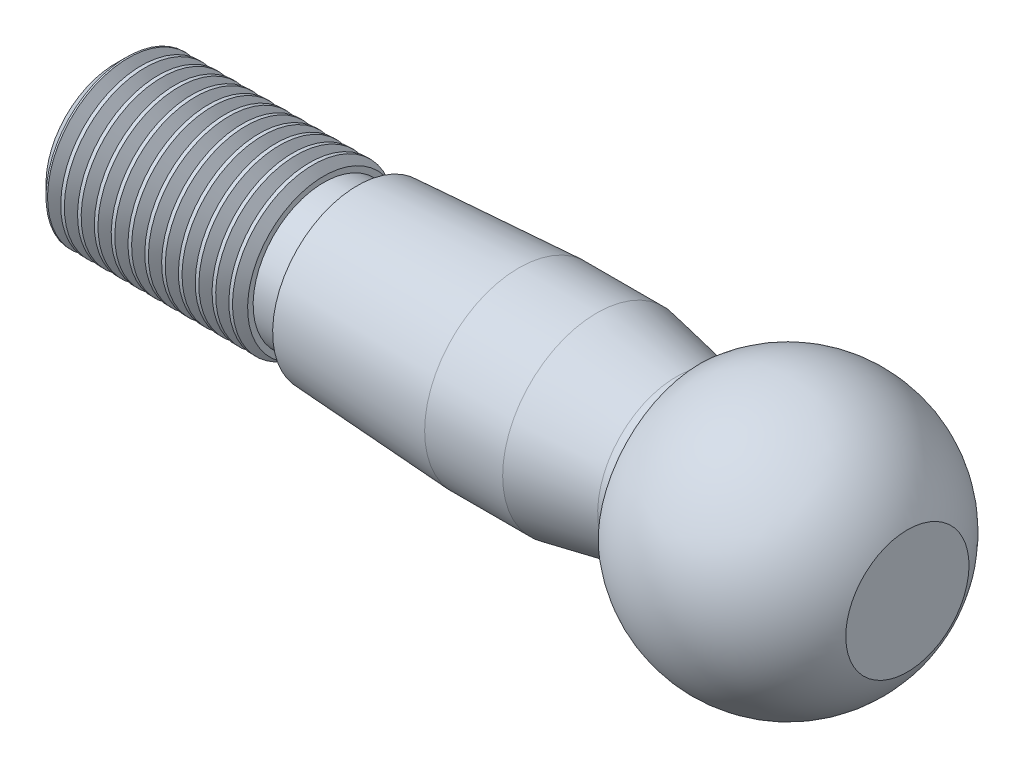
ISO-10303-21;
HEADER;
FILE_DESCRIPTION(('STEP AP214'),'2;1');
FILE_NAME('part.step','',(''),(''),'','','');
FILE_SCHEMA(('AUTOMOTIVE_DESIGN { 1 0 10303 214 1 1 1 1 }'));
ENDSEC;
DATA;
#1=APPLICATION_CONTEXT('core data for automotive mechanical design processes');
#2=APPLICATION_PROTOCOL_DEFINITION('international standard','automotive_design',2000,#1);
#3=PRODUCT_CONTEXT('',#1,'mechanical');
#4=PRODUCT('Part','Part','',(#3));
#5=PRODUCT_RELATED_PRODUCT_CATEGORY('part','',(#4));
#6=PRODUCT_DEFINITION_FORMATION('','',#4);
#7=PRODUCT_DEFINITION_CONTEXT('part definition',#1,'design');
#8=PRODUCT_DEFINITION('design','',#6,#7);
#9=PRODUCT_DEFINITION_SHAPE('','',#8);
#10=(LENGTH_UNIT() NAMED_UNIT(*) SI_UNIT(.MILLI.,.METRE.));
#11=(NAMED_UNIT(*) PLANE_ANGLE_UNIT() SI_UNIT($,.RADIAN.));
#12=(NAMED_UNIT(*) SI_UNIT($,.STERADIAN.) SOLID_ANGLE_UNIT());
#13=UNCERTAINTY_MEASURE_WITH_UNIT(LENGTH_MEASURE(1.E-05),#10,'distance_accuracy_value','');
#14=(GEOMETRIC_REPRESENTATION_CONTEXT(3) GLOBAL_UNCERTAINTY_ASSIGNED_CONTEXT((#13)) GLOBAL_UNIT_ASSIGNED_CONTEXT((#10,
#11,#12)) REPRESENTATION_CONTEXT('',''));
#15=CARTESIAN_POINT('',(0.,0.,0.));
#16=DIRECTION('',(0.,0.,1.));
#17=DIRECTION('',(1.,0.,0.));
#18=AXIS2_PLACEMENT_3D('',#15,#16,#17);
#19=CARTESIAN_POINT('',(0.,0.,0.));
#20=DIRECTION('',(1.,0.,0.));
#21=DIRECTION('',(0.,1.,0.));
#22=AXIS2_PLACEMENT_3D('',#19,#20,#21);
#23=PLANE('',#22);
#24=CARTESIAN_POINT('',(0.,-5.15147186257614,0.));
#25=DIRECTION('',(-1.,0.,0.));
#26=DIRECTION('',(0.,-1.,0.));
#27=AXIS2_PLACEMENT_3D('',#24,#25,#26);
#28=CIRCLE('',#27,5.15147186257614);
#29=CARTESIAN_POINT('',(0.,-10.3029437251523,0.));
#30=VERTEX_POINT('',#29);
#31=EDGE_CURVE('E180',#30,#30,#28,.T.);
#32=ORIENTED_EDGE('',*,*,#31,.T.);
#33=EDGE_LOOP('',(#32));
#34=FACE_BOUND('',#33,.T.);
#35=ADVANCED_FACE('F32',(#34),#23,.F.);
#36=CARTESIAN_POINT('',(58.889857914734,-5.15147186257614,0.));
#37=DIRECTION('',(-1.,0.,0.));
#38=DIRECTION('',(0.,-1.,0.));
#39=AXIS2_PLACEMENT_3D('',#36,#37,#38);
#40=PLANE('',#39);
#41=CARTESIAN_POINT('',(58.889857914734,-5.15147186257615,0.));
#42=DIRECTION('',(-1.,0.,0.));
#43=DIRECTION('',(0.,-1.,0.));
#44=AXIS2_PLACEMENT_3D('',#41,#42,#43);
#45=CIRCLE('',#44,4.57934779808067);
#46=CARTESIAN_POINT('',(58.889857914734,-0.572124064495489,0.));
#47=VERTEX_POINT('',#46);
#48=EDGE_CURVE('E10',#47,#47,#45,.T.);
#49=ORIENTED_EDGE('',*,*,#48,.F.);
#50=EDGE_LOOP('',(#49));
#51=FACE_BOUND('',#50,.T.);
#52=ADVANCED_FACE('F293',(#51),#40,.F.);
#53=CARTESIAN_POINT('',(49.9999999999974,-5.15147186257692,0.));
#54=DIRECTION('',(-1.,0.,0.));
#55=DIRECTION('',(0.,1.,0.));
#56=AXIS2_PLACEMENT_3D('',#53,#54,#55);
#57=SPHERICAL_SURFACE('',#56,9.99999999999993);
#58=CARTESIAN_POINT('',(43.4999999999983,-5.15147186257615,0.));
#59=DIRECTION('',(-1.,0.,0.));
#60=DIRECTION('',(0.,-1.,0.));
#61=AXIS2_PLACEMENT_3D('',#58,#59,#60);
#62=CIRCLE('',#61,7.59934207678523);
#63=CARTESIAN_POINT('',(43.4999999999983,2.44787021420909,0.));
#64=VERTEX_POINT('',#63);
#65=EDGE_CURVE('E38',#64,#64,#62,.T.);
#66=CARTESIAN_POINT('',(43.4999999999983,2.44787021420909,0.));
#67=CARTESIAN_POINT('',(43.6426985310555,2.56993349665166,0.));
#68=CARTESIAN_POINT('',(43.7888423644235,2.68796786990949,0.));
#69=CARTESIAN_POINT('',(44.0875409149576,2.91562535084827,0.));
#70=CARTESIAN_POINT('',(44.2400956321236,3.02524845852923,0.));
#71=CARTESIAN_POINT('',(44.5511362294302,3.23572996110691,0.));
#72=CARTESIAN_POINT('',(44.7096221095707,3.33658835600363,0.));
#73=CARTESIAN_POINT('',(45.0320210437219,3.52922194485484,0.));
#74=CARTESIAN_POINT('',(45.1959340977326,3.62099713880934,0.));
#75=CARTESIAN_POINT('',(45.5286676317694,3.79517274038325,0.));
#76=CARTESIAN_POINT('',(45.6974881117956,3.87757314800266,0.));
#77=CARTESIAN_POINT('',(46.0395007886312,4.03273784884228,0.));
#78=CARTESIAN_POINT('',(46.2126929854406,4.10550214206248,0.));
#79=CARTESIAN_POINT('',(46.5628996210598,4.24116372153425,0.));
#80=CARTESIAN_POINT('',(46.7399140598695,4.30406100778582,0.));
#81=CARTESIAN_POINT('',(47.0972035495632,4.4197890232373,0.));
#82=CARTESIAN_POINT('',(47.2774786004471,4.47261975243721,0.));
#83=CARTESIAN_POINT('',(47.6407173467573,4.56804703257578,0.));
#84=CARTESIAN_POINT('',(47.8236810421836,4.61064358351444,0.));
#85=CARTESIAN_POINT('',(48.1917165776111,4.685467359139,0.));
#86=CARTESIAN_POINT('',(48.3767884176124,4.71769458382491,0.));
#87=CARTESIAN_POINT('',(48.7484530541302,4.77167745760693,0.));
#88=CARTESIAN_POINT('',(48.9350458506468,4.79343310670305,0.));
#89=CARTESIAN_POINT('',(49.3091603863637,4.82640380393439,0.));
#90=CARTESIAN_POINT('',(49.496682125564,4.83761885206962,0.));
#91=CARTESIAN_POINT('',(49.8720595855451,4.84947276473398,0.));
#92=CARTESIAN_POINT('',(50.059915306326,4.85011162926309,0.));
#93=CARTESIAN_POINT('',(50.435364708712,4.84081114775551,0.));
#94=CARTESIAN_POINT('',(50.6229583903172,4.8308718017188,0.));
#95=CARTESIAN_POINT('',(50.9972885249852,4.80044643421914,0.));
#96=CARTESIAN_POINT('',(51.184024978048,4.77996041275619,0.));
#97=CARTESIAN_POINT('',(51.5560481860427,4.72850669159416,0.));
#98=CARTESIAN_POINT('',(51.7413349409746,4.69753899189509,0.));
#99=CARTESIAN_POINT('',(52.1098708826606,4.62522016727989,0.));
#100=CARTESIAN_POINT('',(52.2931200694146,4.58386904236376,0.));
#101=CARTESIAN_POINT('',(52.6569994694088,4.49091456442979,0.));
#102=CARTESIAN_POINT('',(52.837629682649,4.43931121141194,0.));
#103=CARTESIAN_POINT('',(53.1956980396484,4.32601600222911,0.));
#104=CARTESIAN_POINT('',(53.3731361834076,4.26432414606414,0.));
#105=CARTESIAN_POINT('',(53.7242574331436,4.13104766392205,0.));
#106=CARTESIAN_POINT('',(53.8979405391202,4.05946303794493,0.));
#107=CARTESIAN_POINT('',(54.2410006588118,3.90662813687649,0.));
#108=CARTESIAN_POINT('',(54.4103776725266,3.82537786178517,0.));
#109=CARTESIAN_POINT('',(54.744288215419,3.65346944996114,0.));
#110=CARTESIAN_POINT('',(54.9088217445966,3.56281131322845,0.));
#111=CARTESIAN_POINT('',(55.2325232932884,3.37237481443102,0.));
#112=CARTESIAN_POINT('',(55.3916913128027,3.27259645236628,0.));
#113=CARTESIAN_POINT('',(55.7041568407119,3.06423607560379,0.));
#114=CARTESIAN_POINT('',(55.8574543491068,2.95565406090604,0.));
#115=CARTESIAN_POINT('',(56.1576924782645,2.73003088298422,0.));
#116=CARTESIAN_POINT('',(56.3046330990272,2.61298971976015,0.));
#117=CARTESIAN_POINT('',(56.5916912481418,2.37081958941205,0.));
#118=CARTESIAN_POINT('',(56.7318087764936,2.24569062228803,0.));
#119=CARTESIAN_POINT('',(57.004776173327,1.98774188311207,0.));
#120=CARTESIAN_POINT('',(57.1376260418086,1.85492211106013,0.));
#121=CARTESIAN_POINT('',(57.3956366499095,1.58201318557353,0.));
#122=CARTESIAN_POINT('',(57.5207973895289,1.44192403213886,0.));
#123=CARTESIAN_POINT('',(57.7630325175979,1.15492074368089,0.));
#124=CARTESIAN_POINT('',(57.8801069060475,1.00800660865759,0.));
#125=CARTESIAN_POINT('',(58.1057983218094,0.707819738280249,0.));
#126=CARTESIAN_POINT('',(58.2144153491216,0.554547002926202,0.));
#127=CARTESIAN_POINT('',(58.422845789647,0.242128265391791,0.));
#128=CARTESIAN_POINT('',(58.5226592028601,0.0829822632114263,0.));
#129=CARTESIAN_POINT('',(58.7131718422792,-0.240674479248957,0.));
#130=CARTESIAN_POINT('',(58.8038710684853,-0.405185219528976,0.));
#131=CARTESIAN_POINT('',(58.889857914734,-0.572124064495489,0.));
#132=B_SPLINE_CURVE_WITH_KNOTS('',3,(#66,#67,#68,#69,#70,#71,#72,#73,#74,#75,#76,#77,#78,#79,
#80,#81,#82,#83,#84,#85,#86,#87,#88,#89,#90,#91,#92,#93,#94,#95,#96,#97,#98,#99,#100,#101,#102,
#103,#104,#105,#106,#107,#108,#109,#110,#111,#112,#113,#114,#115,#116,#117,#118,#119,#120,#121,
#122,#123,#124,#125,#126,#127,#128,#129,#130,#131),.UNSPECIFIED.,.F.,.F.,(4,2,2,2,2,2,2,2,2,2,2,
2,2,2,2,2,2,2,2,2,2,2,2,2,2,2,2,2,2,2,2,2,4),(0.,0.563272409231917,1.12654481846383,
1.68981722769575,2.25308963692767,2.81636204615959,3.3796344553915,3.94290686462342,
4.50617927385534,5.06945168308726,5.63272409231917,6.19599650155109,6.75926891078301,
7.32254132001492,7.88581372924685,8.44908613847876,9.01235854771068,9.5756309569426,
10.1389033661745,10.7021757754064,11.2654481846383,11.8287205938703,12.3919930031022,
12.9552654123341,13.518537821566,14.0818102307979,14.6450826400298,15.2083550492618,
15.7716274584937,16.3348998677256,16.8981722769575,17.4614446861894,18.0247170954214),.UNSPECIFIED.);
#133=EDGE_CURVE('BSEAM297',#64,#47,#132,.T.);
#134=ORIENTED_EDGE('',*,*,#65,.F.);
#135=ORIENTED_EDGE('',*,*,#48,.T.);
#136=ORIENTED_EDGE('',*,*,#133,.T.);
#137=ORIENTED_EDGE('',*,*,#133,.F.);
#138=EDGE_LOOP('',(#134,#136,#135,#137));
#139=FACE_BOUND('',#138,.T.);
#140=ADVANCED_FACE('F297',(#139),#57,.T.);
#141=CARTESIAN_POINT('',(43.4999999999983,2.44787021420908,0.));
#142=DIRECTION('',(1.,0.,0.));
#143=DIRECTION('',(0.,1.,0.));
#144=AXIS2_PLACEMENT_3D('',#141,#142,#143);
#145=PLANE('',#144);
#146=CARTESIAN_POINT('',(43.4999999999983,-5.15147186257615,0.));
#147=DIRECTION('',(-1.,0.,0.));
#148=DIRECTION('',(0.,-1.,0.));
#149=AXIS2_PLACEMENT_3D('',#146,#147,#148);
#150=CIRCLE('',#149,7.32291712577872);
#151=CARTESIAN_POINT('',(43.4999999999983,-12.4743889883549,0.));
#152=VERTEX_POINT('',#151);
#153=EDGE_CURVE('E42',#152,#152,#150,.T.);
#154=ORIENTED_EDGE('',*,*,#153,.F.);
#155=EDGE_LOOP('',(#154));
#156=FACE_BOUND('',#155,.T.);
#157=ORIENTED_EDGE('',*,*,#65,.T.);
#158=EDGE_LOOP('',(#157));
#159=FACE_BOUND('',#158,.T.);
#160=ADVANCED_FACE('F302',(#156,#159),#145,.F.);
#161=CARTESIAN_POINT('',(41.9999999999983,-5.15147186257615,0.));
#162=DIRECTION('',(-1.,0.,0.));
#163=DIRECTION('',(0.,-1.,0.));
#164=AXIS2_PLACEMENT_3D('',#161,#162,#163);
#165=TOROIDAL_SURFACE('',#164,7.3229171257789,1.49999999999999);
#166=ORIENTED_EDGE('',*,*,#153,.T.);
#167=EDGE_LOOP('',(#166));
#168=FACE_BOUND('',#167,.T.);
#169=CARTESIAN_POINT('',(41.7137865069335,-5.15147186257615,0.));
#170=DIRECTION('',(-1.,0.,0.));
#171=DIRECTION('',(0.,-1.,0.));
#172=AXIS2_PLACEMENT_3D('',#169,#170,#171);
#173=CIRCLE('',#172,5.85047635060741);
#174=CARTESIAN_POINT('',(41.7137865069335,-11.0019482131836,0.));
#175=VERTEX_POINT('',#174);
#176=EDGE_CURVE('E46',#175,#175,#173,.T.);
#177=ORIENTED_EDGE('',*,*,#176,.F.);
#178=EDGE_LOOP('',(#177));
#179=FACE_BOUND('',#178,.T.);
#180=ADVANCED_FACE('F308',(#168,#179),#165,.F.);
#181=CARTESIAN_POINT('',(41.7137865069335,-5.15147186257615,0.));
#182=DIRECTION('',(-1.,0.,0.));
#183=DIRECTION('',(0.,-1.,0.));
#184=AXIS2_PLACEMENT_3D('',#181,#182,#183);
#185=CONICAL_SURFACE('',#184,5.85047635060741,0.191986217719363);
#186=CARTESIAN_POINT('',(35.7999999999983,-5.15147186257615,0.));
#187=DIRECTION('',(-1.,0.,0.));
#188=DIRECTION('',(0.,-1.,0.));
#189=AXIS2_PLACEMENT_3D('',#186,#187,#188);
#190=CIRCLE('',#189,6.99999999999987);
#191=CARTESIAN_POINT('',(35.7999999999983,-12.151471862576,0.));
#192=VERTEX_POINT('',#191);
#193=EDGE_CURVE('E51',#192,#192,#190,.T.);
#194=ORIENTED_EDGE('',*,*,#193,.F.);
#195=EDGE_LOOP('',(#194));
#196=FACE_BOUND('',#195,.T.);
#197=ORIENTED_EDGE('',*,*,#176,.T.);
#198=EDGE_LOOP('',(#197));
#199=FACE_BOUND('',#198,.T.);
#200=ADVANCED_FACE('F312',(#196,#199),#185,.T.);
#201=CARTESIAN_POINT('',(0.,-5.15147186257614,0.));
#202=DIRECTION('',(-1.,0.,0.));
#203=DIRECTION('',(0.,-1.,0.));
#204=AXIS2_PLACEMENT_3D('',#201,#202,#203);
#205=CYLINDRICAL_SURFACE('',#204,6.99999999999987);
#206=CARTESIAN_POINT('',(29.9999999999982,-5.15147186257614,0.));
#207=DIRECTION('',(-1.,0.,0.));
#208=DIRECTION('',(0.,-1.,0.));
#209=AXIS2_PLACEMENT_3D('',#206,#207,#208);
#210=CIRCLE('',#209,6.99999999999987);
#211=CARTESIAN_POINT('',(29.9999999999982,-12.151471862576,0.));
#212=VERTEX_POINT('',#211);
#213=EDGE_CURVE('E54',#212,#212,#210,.T.);
#214=ORIENTED_EDGE('',*,*,#213,.F.);
#215=EDGE_LOOP('',(#214));
#216=FACE_BOUND('',#215,.T.);
#217=ORIENTED_EDGE('',*,*,#193,.T.);
#218=EDGE_LOOP('',(#217));
#219=FACE_BOUND('',#218,.T.);
#220=ADVANCED_FACE('F316',(#216,#219),#205,.T.);
#221=CARTESIAN_POINT('',(29.9999999999982,-5.15147186257614,0.));
#222=DIRECTION('',(1.,0.,0.));
#223=DIRECTION('',(0.,1.,0.));
#224=AXIS2_PLACEMENT_3D('',#221,#222,#223);
#225=CONICAL_SURFACE('',#224,6.99999999999987,0.0582673029695362);
#226=CARTESIAN_POINT('',(17.9999999999978,-5.15147186257614,0.));
#227=DIRECTION('',(-1.,0.,0.));
#228=DIRECTION('',(0.,-1.,0.));
#229=AXIS2_PLACEMENT_3D('',#226,#227,#228);
#230=CIRCLE('',#229,6.29999999999981);
#231=CARTESIAN_POINT('',(17.9999999999978,-11.451471862576,0.));
#232=VERTEX_POINT('',#231);
#233=EDGE_CURVE('E57',#232,#232,#230,.T.);
#234=ORIENTED_EDGE('',*,*,#233,.F.);
#235=EDGE_LOOP('',(#234));
#236=FACE_BOUND('',#235,.T.);
#237=ORIENTED_EDGE('',*,*,#213,.T.);
#238=EDGE_LOOP('',(#237));
#239=FACE_BOUND('',#238,.T.);
#240=ADVANCED_FACE('F320',(#236,#239),#225,.T.);
#241=CARTESIAN_POINT('',(17.9999999999978,-5.15147186257614,0.));
#242=DIRECTION('',(1.,0.,0.));
#243=DIRECTION('',(0.,1.,0.));
#244=AXIS2_PLACEMENT_3D('',#241,#242,#243);
#245=CONICAL_SURFACE('',#244,6.29999999999981,1.0471975511966);
#246=CARTESIAN_POINT('',(17.4515172442679,-5.15147186257614,0.));
#247=DIRECTION('',(-1.,0.,0.));
#248=DIRECTION('',(0.,-1.,0.));
#249=AXIS2_PLACEMENT_3D('',#246,#247,#248);
#250=CIRCLE('',#249,5.35000000000009);
#251=CARTESIAN_POINT('',(17.4515172442679,-10.5014718625762,0.));
#252=VERTEX_POINT('',#251);
#253=EDGE_CURVE('E60',#252,#252,#250,.T.);
#254=ORIENTED_EDGE('',*,*,#253,.F.);
#255=EDGE_LOOP('',(#254));
#256=FACE_BOUND('',#255,.T.);
#257=ORIENTED_EDGE('',*,*,#233,.T.);
#258=EDGE_LOOP('',(#257));
#259=FACE_BOUND('',#258,.T.);
#260=ADVANCED_FACE('F324',(#256,#259),#245,.T.);
#261=CARTESIAN_POINT('',(17.4515172442679,-5.15147186257614,0.));
#262=DIRECTION('',(1.,0.,0.));
#263=DIRECTION('',(0.,1.,0.));
#264=AXIS2_PLACEMENT_3D('',#261,#262,#263);
#265=CONICAL_SURFACE('',#264,5.35000000000009,0.523598775598296);
#266=CARTESIAN_POINT('',(17.2783121635105,-5.15147186257614,0.));
#267=DIRECTION('',(-1.,0.,0.));
#268=DIRECTION('',(0.,-1.,0.));
#269=AXIS2_PLACEMENT_3D('',#266,#267,#268);
#270=CIRCLE('',#269,5.24999999999984);
#271=CARTESIAN_POINT('',(17.2783121635105,-10.401471862576,0.));
#272=VERTEX_POINT('',#271);
#273=EDGE_CURVE('E63',#272,#272,#270,.T.);
#274=ORIENTED_EDGE('',*,*,#273,.F.);
#275=EDGE_LOOP('',(#274));
#276=FACE_BOUND('',#275,.T.);
#277=ORIENTED_EDGE('',*,*,#253,.T.);
#278=EDGE_LOOP('',(#277));
#279=FACE_BOUND('',#278,.T.);
#280=ADVANCED_FACE('F328',(#276,#279),#265,.T.);
#281=CARTESIAN_POINT('',(0.,-5.15147186257614,0.));
#282=DIRECTION('',(-1.,0.,0.));
#283=DIRECTION('',(0.,-1.,0.));
#284=AXIS2_PLACEMENT_3D('',#281,#282,#283);
#285=CYLINDRICAL_SURFACE('',#284,5.24999999999984);
#286=CARTESIAN_POINT('',(15.4999999999977,-5.15147186257614,0.));
#287=DIRECTION('',(-1.,0.,0.));
#288=DIRECTION('',(0.,-1.,0.));
#289=AXIS2_PLACEMENT_3D('',#286,#287,#288);
#290=CIRCLE('',#289,5.24999999999984);
#291=CARTESIAN_POINT('',(15.4999999999977,-10.401471862576,0.));
#292=VERTEX_POINT('',#291);
#293=EDGE_CURVE('E66',#292,#292,#290,.T.);
#294=ORIENTED_EDGE('',*,*,#293,.F.);
#295=EDGE_LOOP('',(#294));
#296=FACE_BOUND('',#295,.T.);
#297=ORIENTED_EDGE('',*,*,#273,.T.);
#298=EDGE_LOOP('',(#297));
#299=FACE_BOUND('',#298,.T.);
#300=ADVANCED_FACE('F332',(#296,#299),#285,.T.);
#301=CARTESIAN_POINT('',(15.4999999999977,0.0985281374236924,0.));
#302=DIRECTION('',(-1.,0.,0.));
#303=DIRECTION('',(0.,-1.,0.));
#304=AXIS2_PLACEMENT_3D('',#301,#302,#303);
#305=PLANE('',#304);
#306=CARTESIAN_POINT('',(15.4999999999977,-5.15147186257614,0.));
#307=DIRECTION('',(-1.,0.,0.));
#308=DIRECTION('',(0.,-1.,0.));
#309=AXIS2_PLACEMENT_3D('',#306,#307,#308);
#310=CIRCLE('',#309,5.66038349988469);
#311=CARTESIAN_POINT('',(15.4999999999977,-10.8118553624608,0.));
#312=VERTEX_POINT('',#311);
#313=EDGE_CURVE('E69',#312,#312,#310,.T.);
#314=ORIENTED_EDGE('',*,*,#313,.F.);
#315=EDGE_LOOP('',(#314));
#316=FACE_BOUND('',#315,.T.);
#317=ORIENTED_EDGE('',*,*,#293,.T.);
#318=EDGE_LOOP('',(#317));
#319=FACE_BOUND('',#318,.T.);
#320=ADVANCED_FACE('F336',(#316,#319),#305,.F.);
#321=CARTESIAN_POINT('',(15.4999999999977,-5.15147186257614,0.));
#322=DIRECTION('',(1.,0.,0.));
#323=DIRECTION('',(0.,1.,0.));
#324=AXIS2_PLACEMENT_3D('',#321,#322,#323);
#325=CONICAL_SURFACE('',#324,5.66038349988469,1.0471975511966);
#326=CARTESIAN_POINT('',(15.2053299489492,-5.15147186257614,0.));
#327=DIRECTION('',(-1.,0.,0.));
#328=DIRECTION('',(0.,-1.,0.));
#329=AXIS2_PLACEMENT_3D('',#326,#327,#328);
#330=CIRCLE('',#329,5.14999999999977);
#331=CARTESIAN_POINT('',(15.2053299489492,-10.3014718625759,0.));
#332=VERTEX_POINT('',#331);
#333=EDGE_CURVE('E72',#332,#332,#330,.T.);
#334=ORIENTED_EDGE('',*,*,#333,.F.);
#335=EDGE_LOOP('',(#334));
#336=FACE_BOUND('',#335,.T.);
#337=ORIENTED_EDGE('',*,*,#313,.T.);
#338=EDGE_LOOP('',(#337));
#339=FACE_BOUND('',#338,.T.);
#340=ADVANCED_FACE('F340',(#336,#339),#325,.T.);
#341=CARTESIAN_POINT('',(15.2053299489492,-5.15147186257614,0.));
#342=DIRECTION('',(-1.,0.,0.));
#343=DIRECTION('',(0.,-1.,0.));
#344=AXIS2_PLACEMENT_3D('',#341,#342,#343);
#345=CONICAL_SURFACE('',#344,5.14999999999977,1.0471975511966);
#346=CARTESIAN_POINT('',(14.714582220138,-5.15147186257614,0.));
#347=DIRECTION('',(-1.,0.,0.));
#348=DIRECTION('',(0.,-1.,0.));
#349=AXIS2_PLACEMENT_3D('',#346,#347,#348);
#350=CIRCLE('',#349,5.99999999999979);
#351=CARTESIAN_POINT('',(14.714582220138,-11.1514718625759,0.));
#352=VERTEX_POINT('',#351);
#353=EDGE_CURVE('E75',#352,#352,#350,.T.);
#354=ORIENTED_EDGE('',*,*,#353,.F.);
#355=EDGE_LOOP('',(#354));
#356=FACE_BOUND('',#355,.T.);
#357=ORIENTED_EDGE('',*,*,#333,.T.);
#358=EDGE_LOOP('',(#357));
#359=FACE_BOUND('',#358,.T.);
#360=ADVANCED_FACE('F344',(#356,#359),#345,.T.);
#361=CARTESIAN_POINT('',(0.,-5.15147186257614,0.));
#362=DIRECTION('',(-1.,0.,0.));
#363=DIRECTION('',(0.,-1.,0.));
#364=AXIS2_PLACEMENT_3D('',#361,#362,#363);
#365=CYLINDRICAL_SURFACE('',#364,5.99999999999979);
#366=CARTESIAN_POINT('',(14.4460776777604,-5.15147186257614,0.));
#367=DIRECTION('',(-1.,0.,0.));
#368=DIRECTION('',(0.,-1.,0.));
#369=AXIS2_PLACEMENT_3D('',#366,#367,#368);
#370=CIRCLE('',#369,5.99999999999979);
#371=CARTESIAN_POINT('',(14.4460776777604,-11.1514718625759,0.));
#372=VERTEX_POINT('',#371);
#373=EDGE_CURVE('E78',#372,#372,#370,.T.);
#374=ORIENTED_EDGE('',*,*,#373,.F.);
#375=EDGE_LOOP('',(#374));
#376=FACE_BOUND('',#375,.T.);
#377=ORIENTED_EDGE('',*,*,#353,.T.);
#378=EDGE_LOOP('',(#377));
#379=FACE_BOUND('',#378,.T.);
#380=ADVANCED_FACE('F348',(#376,#379),#365,.T.);
#381=CARTESIAN_POINT('',(14.4460776777604,-5.15147186257614,0.));
#382=DIRECTION('',(1.,0.,0.));
#383=DIRECTION('',(0.,1.,0.));
#384=AXIS2_PLACEMENT_3D('',#381,#382,#383);
#385=CONICAL_SURFACE('',#384,5.99999999999979,1.0471975511966);
#386=CARTESIAN_POINT('',(13.9553299489492,-5.15147186257614,0.));
#387=DIRECTION('',(-1.,0.,0.));
#388=DIRECTION('',(0.,-1.,0.));
#389=AXIS2_PLACEMENT_3D('',#386,#387,#388);
#390=CIRCLE('',#389,5.14999999999977);
#391=CARTESIAN_POINT('',(13.9553299489492,-10.3014718625759,0.));
#392=VERTEX_POINT('',#391);
#393=EDGE_CURVE('E81',#392,#392,#390,.T.);
#394=ORIENTED_EDGE('',*,*,#393,.F.);
#395=EDGE_LOOP('',(#394));
#396=FACE_BOUND('',#395,.T.);
#397=ORIENTED_EDGE('',*,*,#373,.T.);
#398=EDGE_LOOP('',(#397));
#399=FACE_BOUND('',#398,.T.);
#400=ADVANCED_FACE('F352',(#396,#399),#385,.T.);
#401=CARTESIAN_POINT('',(13.9553299489492,-5.15147186257614,0.));
#402=DIRECTION('',(-1.,0.,0.));
#403=DIRECTION('',(0.,-1.,0.));
#404=AXIS2_PLACEMENT_3D('',#401,#402,#403);
#405=CONICAL_SURFACE('',#404,5.14999999999977,1.0471975511966);
#406=CARTESIAN_POINT('',(13.464582220138,-5.15147186257614,0.));
#407=DIRECTION('',(-1.,0.,0.));
#408=DIRECTION('',(0.,-1.,0.));
#409=AXIS2_PLACEMENT_3D('',#406,#407,#408);
#410=CIRCLE('',#409,5.99999999999979);
#411=CARTESIAN_POINT('',(13.464582220138,-11.1514718625759,0.));
#412=VERTEX_POINT('',#411);
#413=EDGE_CURVE('E84',#412,#412,#410,.T.);
#414=ORIENTED_EDGE('',*,*,#413,.F.);
#415=EDGE_LOOP('',(#414));
#416=FACE_BOUND('',#415,.T.);
#417=ORIENTED_EDGE('',*,*,#393,.T.);
#418=EDGE_LOOP('',(#417));
#419=FACE_BOUND('',#418,.T.);
#420=ADVANCED_FACE('F356',(#416,#419),#405,.T.);
#421=CARTESIAN_POINT('',(0.,-5.15147186257614,0.));
#422=DIRECTION('',(-1.,0.,0.));
#423=DIRECTION('',(0.,-1.,0.));
#424=AXIS2_PLACEMENT_3D('',#421,#422,#423);
#425=CYLINDRICAL_SURFACE('',#424,5.99999999999979);
#426=CARTESIAN_POINT('',(13.1960776777603,-5.15147186257614,0.));
#427=DIRECTION('',(-1.,0.,0.));
#428=DIRECTION('',(0.,-1.,0.));
#429=AXIS2_PLACEMENT_3D('',#426,#427,#428);
#430=CIRCLE('',#429,5.99999999999979);
#431=CARTESIAN_POINT('',(13.1960776777603,-11.1514718625759,0.));
#432=VERTEX_POINT('',#431);
#433=EDGE_CURVE('E87',#432,#432,#430,.T.);
#434=ORIENTED_EDGE('',*,*,#433,.F.);
#435=EDGE_LOOP('',(#434));
#436=FACE_BOUND('',#435,.T.);
#437=ORIENTED_EDGE('',*,*,#413,.T.);
#438=EDGE_LOOP('',(#437));
#439=FACE_BOUND('',#438,.T.);
#440=ADVANCED_FACE('F360',(#436,#439),#425,.T.);
#441=CARTESIAN_POINT('',(13.1960776777603,-5.15147186257614,0.));
#442=DIRECTION('',(1.,0.,0.));
#443=DIRECTION('',(0.,1.,0.));
#444=AXIS2_PLACEMENT_3D('',#441,#442,#443);
#445=CONICAL_SURFACE('',#444,5.99999999999979,1.0471975511966);
#446=CARTESIAN_POINT('',(12.7053299489491,-5.15147186257614,0.));
#447=DIRECTION('',(-1.,0.,0.));
#448=DIRECTION('',(0.,-1.,0.));
#449=AXIS2_PLACEMENT_3D('',#446,#447,#448);
#450=CIRCLE('',#449,5.14999999999977);
#451=CARTESIAN_POINT('',(12.7053299489491,-10.3014718625759,0.));
#452=VERTEX_POINT('',#451);
#453=EDGE_CURVE('E90',#452,#452,#450,.T.);
#454=ORIENTED_EDGE('',*,*,#453,.F.);
#455=EDGE_LOOP('',(#454));
#456=FACE_BOUND('',#455,.T.);
#457=ORIENTED_EDGE('',*,*,#433,.T.);
#458=EDGE_LOOP('',(#457));
#459=FACE_BOUND('',#458,.T.);
#460=ADVANCED_FACE('F364',(#456,#459),#445,.T.);
#461=CARTESIAN_POINT('',(12.7053299489491,-5.15147186257614,0.));
#462=DIRECTION('',(-1.,0.,0.));
#463=DIRECTION('',(0.,-1.,0.));
#464=AXIS2_PLACEMENT_3D('',#461,#462,#463);
#465=CONICAL_SURFACE('',#464,5.14999999999977,1.0471975511966);
#466=CARTESIAN_POINT('',(12.214582220138,-5.15147186257614,0.));
#467=DIRECTION('',(-1.,0.,0.));
#468=DIRECTION('',(0.,-1.,0.));
#469=AXIS2_PLACEMENT_3D('',#466,#467,#468);
#470=CIRCLE('',#469,5.99999999999979);
#471=CARTESIAN_POINT('',(12.214582220138,-11.1514718625759,0.));
#472=VERTEX_POINT('',#471);
#473=EDGE_CURVE('E93',#472,#472,#470,.T.);
#474=ORIENTED_EDGE('',*,*,#473,.F.);
#475=EDGE_LOOP('',(#474));
#476=FACE_BOUND('',#475,.T.);
#477=ORIENTED_EDGE('',*,*,#453,.T.);
#478=EDGE_LOOP('',(#477));
#479=FACE_BOUND('',#478,.T.);
#480=ADVANCED_FACE('F368',(#476,#479),#465,.T.);
#481=CARTESIAN_POINT('',(0.,-5.15147186257614,0.));
#482=DIRECTION('',(-1.,0.,0.));
#483=DIRECTION('',(0.,-1.,0.));
#484=AXIS2_PLACEMENT_3D('',#481,#482,#483);
#485=CYLINDRICAL_SURFACE('',#484,5.99999999999979);
#486=CARTESIAN_POINT('',(11.9460776777603,-5.15147186257614,0.));
#487=DIRECTION('',(-1.,0.,0.));
#488=DIRECTION('',(0.,-1.,0.));
#489=AXIS2_PLACEMENT_3D('',#486,#487,#488);
#490=CIRCLE('',#489,5.99999999999979);
#491=CARTESIAN_POINT('',(11.9460776777603,-11.1514718625759,0.));
#492=VERTEX_POINT('',#491);
#493=EDGE_CURVE('E96',#492,#492,#490,.T.);
#494=ORIENTED_EDGE('',*,*,#493,.F.);
#495=EDGE_LOOP('',(#494));
#496=FACE_BOUND('',#495,.T.);
#497=ORIENTED_EDGE('',*,*,#473,.T.);
#498=EDGE_LOOP('',(#497));
#499=FACE_BOUND('',#498,.T.);
#500=ADVANCED_FACE('F372',(#496,#499),#485,.T.);
#501=CARTESIAN_POINT('',(11.9460776777603,-5.15147186257614,0.));
#502=DIRECTION('',(1.,0.,0.));
#503=DIRECTION('',(0.,1.,0.));
#504=AXIS2_PLACEMENT_3D('',#501,#502,#503);
#505=CONICAL_SURFACE('',#504,5.99999999999979,1.0471975511966);
#506=CARTESIAN_POINT('',(11.4553299489491,-5.15147186257614,0.));
#507=DIRECTION('',(-1.,0.,0.));
#508=DIRECTION('',(0.,-1.,0.));
#509=AXIS2_PLACEMENT_3D('',#506,#507,#508);
#510=CIRCLE('',#509,5.14999999999978);
#511=CARTESIAN_POINT('',(11.4553299489491,-10.3014718625759,0.));
#512=VERTEX_POINT('',#511);
#513=EDGE_CURVE('E99',#512,#512,#510,.T.);
#514=ORIENTED_EDGE('',*,*,#513,.F.);
#515=EDGE_LOOP('',(#514));
#516=FACE_BOUND('',#515,.T.);
#517=ORIENTED_EDGE('',*,*,#493,.T.);
#518=EDGE_LOOP('',(#517));
#519=FACE_BOUND('',#518,.T.);
#520=ADVANCED_FACE('F376',(#516,#519),#505,.T.);
#521=CARTESIAN_POINT('',(11.4553299489491,-5.15147186257614,0.));
#522=DIRECTION('',(-1.,0.,0.));
#523=DIRECTION('',(0.,-1.,0.));
#524=AXIS2_PLACEMENT_3D('',#521,#522,#523);
#525=CONICAL_SURFACE('',#524,5.14999999999978,1.0471975511966);
#526=CARTESIAN_POINT('',(10.9645822201379,-5.15147186257614,0.));
#527=DIRECTION('',(-1.,0.,0.));
#528=DIRECTION('',(0.,-1.,0.));
#529=AXIS2_PLACEMENT_3D('',#526,#527,#528);
#530=CIRCLE('',#529,5.9999999999998);
#531=CARTESIAN_POINT('',(10.9645822201379,-11.1514718625759,0.));
#532=VERTEX_POINT('',#531);
#533=EDGE_CURVE('E102',#532,#532,#530,.T.);
#534=ORIENTED_EDGE('',*,*,#533,.F.);
#535=EDGE_LOOP('',(#534));
#536=FACE_BOUND('',#535,.T.);
#537=ORIENTED_EDGE('',*,*,#513,.T.);
#538=EDGE_LOOP('',(#537));
#539=FACE_BOUND('',#538,.T.);
#540=ADVANCED_FACE('F380',(#536,#539),#525,.T.);
#541=CARTESIAN_POINT('',(0.,-5.15147186257614,0.));
#542=DIRECTION('',(-1.,0.,0.));
#543=DIRECTION('',(0.,-1.,0.));
#544=AXIS2_PLACEMENT_3D('',#541,#542,#543);
#545=CYLINDRICAL_SURFACE('',#544,5.9999999999998);
#546=CARTESIAN_POINT('',(10.6960776777603,-5.15147186257614,0.));
#547=DIRECTION('',(-1.,0.,0.));
#548=DIRECTION('',(0.,-1.,0.));
#549=AXIS2_PLACEMENT_3D('',#546,#547,#548);
#550=CIRCLE('',#549,5.9999999999998);
#551=CARTESIAN_POINT('',(10.6960776777603,-11.1514718625759,0.));
#552=VERTEX_POINT('',#551);
#553=EDGE_CURVE('E105',#552,#552,#550,.T.);
#554=ORIENTED_EDGE('',*,*,#553,.F.);
#555=EDGE_LOOP('',(#554));
#556=FACE_BOUND('',#555,.T.);
#557=ORIENTED_EDGE('',*,*,#533,.T.);
#558=EDGE_LOOP('',(#557));
#559=FACE_BOUND('',#558,.T.);
#560=ADVANCED_FACE('F384',(#556,#559),#545,.T.);
#561=CARTESIAN_POINT('',(10.6960776777603,-5.15147186257614,0.));
#562=DIRECTION('',(1.,0.,0.));
#563=DIRECTION('',(0.,1.,0.));
#564=AXIS2_PLACEMENT_3D('',#561,#562,#563);
#565=CONICAL_SURFACE('',#564,5.9999999999998,1.0471975511966);
#566=CARTESIAN_POINT('',(10.2053299489492,-5.15147186257614,0.));
#567=DIRECTION('',(-1.,0.,0.));
#568=DIRECTION('',(0.,-1.,0.));
#569=AXIS2_PLACEMENT_3D('',#566,#567,#568);
#570=CIRCLE('',#569,5.14999999999978);
#571=CARTESIAN_POINT('',(10.2053299489492,-10.3014718625759,0.));
#572=VERTEX_POINT('',#571);
#573=EDGE_CURVE('E108',#572,#572,#570,.T.);
#574=ORIENTED_EDGE('',*,*,#573,.F.);
#575=EDGE_LOOP('',(#574));
#576=FACE_BOUND('',#575,.T.);
#577=ORIENTED_EDGE('',*,*,#553,.T.);
#578=EDGE_LOOP('',(#577));
#579=FACE_BOUND('',#578,.T.);
#580=ADVANCED_FACE('F388',(#576,#579),#565,.T.);
#581=CARTESIAN_POINT('',(10.2053299489492,-5.15147186257614,0.));
#582=DIRECTION('',(-1.,0.,0.));
#583=DIRECTION('',(0.,-1.,0.));
#584=AXIS2_PLACEMENT_3D('',#581,#582,#583);
#585=CONICAL_SURFACE('',#584,5.14999999999978,1.0471975511966);
#586=CARTESIAN_POINT('',(9.71458222013795,-5.15147186257614,0.));
#587=DIRECTION('',(-1.,0.,0.));
#588=DIRECTION('',(0.,-1.,0.));
#589=AXIS2_PLACEMENT_3D('',#586,#587,#588);
#590=CIRCLE('',#589,5.99999999999983);
#591=CARTESIAN_POINT('',(9.71458222013795,-11.151471862576,0.));
#592=VERTEX_POINT('',#591);
#593=EDGE_CURVE('E111',#592,#592,#590,.T.);
#594=ORIENTED_EDGE('',*,*,#593,.F.);
#595=EDGE_LOOP('',(#594));
#596=FACE_BOUND('',#595,.T.);
#597=ORIENTED_EDGE('',*,*,#573,.T.);
#598=EDGE_LOOP('',(#597));
#599=FACE_BOUND('',#598,.T.);
#600=ADVANCED_FACE('F392',(#596,#599),#585,.T.);
#601=CARTESIAN_POINT('',(0.,-5.15147186257614,0.));
#602=DIRECTION('',(-1.,0.,0.));
#603=DIRECTION('',(0.,-1.,0.));
#604=AXIS2_PLACEMENT_3D('',#601,#602,#603);
#605=CYLINDRICAL_SURFACE('',#604,5.99999999999983);
#606=CARTESIAN_POINT('',(9.44607767776026,-5.15147186257614,0.));
#607=DIRECTION('',(-1.,0.,0.));
#608=DIRECTION('',(0.,-1.,0.));
#609=AXIS2_PLACEMENT_3D('',#606,#607,#608);
#610=CIRCLE('',#609,5.99999999999983);
#611=CARTESIAN_POINT('',(9.44607767776026,-11.151471862576,0.));
#612=VERTEX_POINT('',#611);
#613=EDGE_CURVE('E114',#612,#612,#610,.T.);
#614=ORIENTED_EDGE('',*,*,#613,.F.);
#615=EDGE_LOOP('',(#614));
#616=FACE_BOUND('',#615,.T.);
#617=ORIENTED_EDGE('',*,*,#593,.T.);
#618=EDGE_LOOP('',(#617));
#619=FACE_BOUND('',#618,.T.);
#620=ADVANCED_FACE('F396',(#616,#619),#605,.T.);
#621=CARTESIAN_POINT('',(9.44607767776026,-5.15147186257614,0.));
#622=DIRECTION('',(1.,0.,0.));
#623=DIRECTION('',(0.,1.,0.));
#624=AXIS2_PLACEMENT_3D('',#621,#622,#623);
#625=CONICAL_SURFACE('',#624,5.99999999999983,1.0471975511966);
#626=CARTESIAN_POINT('',(8.95532994894901,-5.15147186257614,0.));
#627=DIRECTION('',(-1.,0.,0.));
#628=DIRECTION('',(0.,-1.,0.));
#629=AXIS2_PLACEMENT_3D('',#626,#627,#628);
#630=CIRCLE('',#629,5.14999999999969);
#631=CARTESIAN_POINT('',(8.95532994894901,-10.3014718625758,0.));
#632=VERTEX_POINT('',#631);
#633=EDGE_CURVE('E117',#632,#632,#630,.T.);
#634=ORIENTED_EDGE('',*,*,#633,.F.);
#635=EDGE_LOOP('',(#634));
#636=FACE_BOUND('',#635,.T.);
#637=ORIENTED_EDGE('',*,*,#613,.T.);
#638=EDGE_LOOP('',(#637));
#639=FACE_BOUND('',#638,.T.);
#640=ADVANCED_FACE('F400',(#636,#639),#625,.T.);
#641=CARTESIAN_POINT('',(8.95532994894901,-5.15147186257614,0.));
#642=DIRECTION('',(-1.,0.,0.));
#643=DIRECTION('',(0.,-1.,0.));
#644=AXIS2_PLACEMENT_3D('',#641,#642,#643);
#645=CONICAL_SURFACE('',#644,5.14999999999969,1.0471975511966);
#646=CARTESIAN_POINT('',(8.46458222013795,-5.15147186257614,0.));
#647=DIRECTION('',(-1.,0.,0.));
#648=DIRECTION('',(0.,-1.,0.));
#649=AXIS2_PLACEMENT_3D('',#646,#647,#648);
#650=CIRCLE('',#649,5.99999999999948);
#651=CARTESIAN_POINT('',(8.46458222013795,-11.1514718625756,0.));
#652=VERTEX_POINT('',#651);
#653=EDGE_CURVE('E120',#652,#652,#650,.T.);
#654=ORIENTED_EDGE('',*,*,#653,.F.);
#655=EDGE_LOOP('',(#654));
#656=FACE_BOUND('',#655,.T.);
#657=ORIENTED_EDGE('',*,*,#633,.T.);
#658=EDGE_LOOP('',(#657));
#659=FACE_BOUND('',#658,.T.);
#660=ADVANCED_FACE('F404',(#656,#659),#645,.T.);
#661=CARTESIAN_POINT('',(0.,-5.15147186257614,0.));
#662=DIRECTION('',(-1.,0.,0.));
#663=DIRECTION('',(0.,-1.,0.));
#664=AXIS2_PLACEMENT_3D('',#661,#662,#663);
#665=CYLINDRICAL_SURFACE('',#664,5.99999999999934);
#666=CARTESIAN_POINT('',(8.19607767776272,-5.15147186257614,0.));
#667=DIRECTION('',(-1.,0.,0.));
#668=DIRECTION('',(0.,-1.,0.));
#669=AXIS2_PLACEMENT_3D('',#666,#667,#668);
#670=CIRCLE('',#669,5.99999999999921);
#671=CARTESIAN_POINT('',(8.19607767776272,-11.1514718625754,0.));
#672=VERTEX_POINT('',#671);
#673=EDGE_CURVE('E123',#672,#672,#670,.T.);
#674=ORIENTED_EDGE('',*,*,#673,.F.);
#675=EDGE_LOOP('',(#674));
#676=FACE_BOUND('',#675,.T.);
#677=ORIENTED_EDGE('',*,*,#653,.T.);
#678=EDGE_LOOP('',(#677));
#679=FACE_BOUND('',#678,.T.);
#680=ADVANCED_FACE('F408',(#676,#679),#665,.T.);
#681=CARTESIAN_POINT('',(8.19607767776272,-5.15147186257614,0.));
#682=DIRECTION('',(1.,0.,0.));
#683=DIRECTION('',(0.,1.,0.));
#684=AXIS2_PLACEMENT_3D('',#681,#682,#683);
#685=CONICAL_SURFACE('',#684,5.99999999999921,1.04719755119614);
#686=CARTESIAN_POINT('',(7.70532994895146,-5.15147186257614,0.));
#687=DIRECTION('',(-1.,0.,0.));
#688=DIRECTION('',(0.,-1.,0.));
#689=AXIS2_PLACEMENT_3D('',#686,#687,#688);
#690=CIRCLE('',#689,5.14999999999996);
#691=CARTESIAN_POINT('',(7.70532994895145,-10.3014718625761,0.));
#692=VERTEX_POINT('',#691);
#693=EDGE_CURVE('E126',#692,#692,#690,.T.);
#694=ORIENTED_EDGE('',*,*,#693,.F.);
#695=EDGE_LOOP('',(#694));
#696=FACE_BOUND('',#695,.T.);
#697=ORIENTED_EDGE('',*,*,#673,.T.);
#698=EDGE_LOOP('',(#697));
#699=FACE_BOUND('',#698,.T.);
#700=ADVANCED_FACE('F289',(#696,#699),#685,.T.);
#701=CARTESIAN_POINT('',(7.70532994895146,-5.15147186257614,0.));
#702=DIRECTION('',(-1.,0.,0.));
#703=DIRECTION('',(0.,-1.,0.));
#704=AXIS2_PLACEMENT_3D('',#701,#702,#703);
#705=CONICAL_SURFACE('',#704,5.14999999999996,1.0471975511966);
#706=CARTESIAN_POINT('',(7.21458222014026,-5.15147186257614,0.));
#707=DIRECTION('',(-1.,0.,0.));
#708=DIRECTION('',(0.,-1.,0.));
#709=AXIS2_PLACEMENT_3D('',#706,#707,#708);
#710=CIRCLE('',#709,5.99999999999998);
#711=CARTESIAN_POINT('',(7.21458222014026,-11.1514718625761,0.));
#712=VERTEX_POINT('',#711);
#713=EDGE_CURVE('E129',#712,#712,#710,.T.);
#714=ORIENTED_EDGE('',*,*,#713,.F.);
#715=EDGE_LOOP('',(#714));
#716=FACE_BOUND('',#715,.T.);
#717=ORIENTED_EDGE('',*,*,#693,.T.);
#718=EDGE_LOOP('',(#717));
#719=FACE_BOUND('',#718,.T.);
#720=ADVANCED_FACE('F283',(#716,#719),#705,.T.);
#721=CARTESIAN_POINT('',(0.,-5.15147186257614,0.));
#722=DIRECTION('',(-1.,0.,0.));
#723=DIRECTION('',(0.,-1.,0.));
#724=AXIS2_PLACEMENT_3D('',#721,#722,#723);
#725=CYLINDRICAL_SURFACE('',#724,5.9999999999998);
#726=ORIENTED_EDGE('',*,*,#713,.T.);
#727=EDGE_LOOP('',(#726));
#728=FACE_BOUND('',#727,.T.);
#729=CARTESIAN_POINT('',(6.9460776777628,-5.15147186257614,0.));
#730=DIRECTION('',(-1.,0.,0.));
#731=DIRECTION('',(0.,-1.,0.));
#732=AXIS2_PLACEMENT_3D('',#729,#730,#731);
#733=CIRCLE('',#732,5.99999999999962);
#734=CARTESIAN_POINT('',(6.9460776777628,-11.1514718625758,0.));
#735=VERTEX_POINT('',#734);
#736=EDGE_CURVE('E132',#735,#735,#733,.T.);
#737=ORIENTED_EDGE('',*,*,#736,.F.);
#738=EDGE_LOOP('',(#737));
#739=FACE_BOUND('',#738,.T.);
#740=ADVANCED_FACE('F278',(#728,#739),#725,.T.);
#741=CARTESIAN_POINT('',(6.9460776777628,-5.15147186257614,0.));
#742=DIRECTION('',(1.,0.,0.));
#743=DIRECTION('',(0.,1.,0.));
#744=AXIS2_PLACEMENT_3D('',#741,#742,#743);
#745=CONICAL_SURFACE('',#744,5.99999999999962,1.0471975511966);
#746=CARTESIAN_POINT('',(6.45532994895162,-5.15147186257614,0.));
#747=DIRECTION('',(-1.,0.,0.));
#748=DIRECTION('',(0.,-1.,0.));
#749=AXIS2_PLACEMENT_3D('',#746,#747,#748);
#750=CIRCLE('',#749,5.14999999999962);
#751=CARTESIAN_POINT('',(6.45532994895162,-10.3014718625758,0.));
#752=VERTEX_POINT('',#751);
#753=EDGE_CURVE('E135',#752,#752,#750,.T.);
#754=ORIENTED_EDGE('',*,*,#753,.F.);
#755=EDGE_LOOP('',(#754));
#756=FACE_BOUND('',#755,.T.);
#757=ORIENTED_EDGE('',*,*,#736,.T.);
#758=EDGE_LOOP('',(#757));
#759=FACE_BOUND('',#758,.T.);
#760=ADVANCED_FACE('F272',(#756,#759),#745,.T.);
#761=CARTESIAN_POINT('',(6.45532994895162,-5.15147186257614,0.));
#762=DIRECTION('',(-1.,0.,0.));
#763=DIRECTION('',(0.,-1.,0.));
#764=AXIS2_PLACEMENT_3D('',#761,#762,#763);
#765=CONICAL_SURFACE('',#764,5.14999999999962,1.04719755119663);
#766=CARTESIAN_POINT('',(5.96458222014023,-5.15147186257614,0.));
#767=DIRECTION('',(-1.,0.,0.));
#768=DIRECTION('',(0.,-1.,0.));
#769=AXIS2_PLACEMENT_3D('',#766,#767,#768);
#770=CIRCLE('',#769,6.00000000000005);
#771=CARTESIAN_POINT('',(5.96458222014023,-11.1514718625762,0.));
#772=VERTEX_POINT('',#771);
#773=EDGE_CURVE('E138',#772,#772,#770,.T.);
#774=ORIENTED_EDGE('',*,*,#773,.F.);
#775=EDGE_LOOP('',(#774));
#776=FACE_BOUND('',#775,.T.);
#777=ORIENTED_EDGE('',*,*,#753,.T.);
#778=EDGE_LOOP('',(#777));
#779=FACE_BOUND('',#778,.T.);
#780=ADVANCED_FACE('F266',(#776,#779),#765,.T.);
#781=CARTESIAN_POINT('',(0.,-5.15147186257614,0.));
#782=DIRECTION('',(-1.,0.,0.));
#783=DIRECTION('',(0.,-1.,0.));
#784=AXIS2_PLACEMENT_3D('',#781,#782,#783);
#785=CYLINDRICAL_SURFACE('',#784,6.00000000000002);
#786=CARTESIAN_POINT('',(5.69607767776264,-5.15147186257614,0.));
#787=DIRECTION('',(-1.,0.,0.));
#788=DIRECTION('',(0.,-1.,0.));
#789=AXIS2_PLACEMENT_3D('',#786,#787,#788);
#790=CIRCLE('',#789,5.99999999999998);
#791=CARTESIAN_POINT('',(5.69607767776264,-11.1514718625761,0.));
#792=VERTEX_POINT('',#791);
#793=EDGE_CURVE('E141',#792,#792,#790,.T.);
#794=ORIENTED_EDGE('',*,*,#793,.F.);
#795=EDGE_LOOP('',(#794));
#796=FACE_BOUND('',#795,.T.);
#797=ORIENTED_EDGE('',*,*,#773,.T.);
#798=EDGE_LOOP('',(#797));
#799=FACE_BOUND('',#798,.T.);
#800=ADVANCED_FACE('F260',(#796,#799),#785,.T.);
#801=CARTESIAN_POINT('',(5.69607767776264,-5.15147186257614,0.));
#802=DIRECTION('',(1.,0.,0.));
#803=DIRECTION('',(0.,1.,0.));
#804=AXIS2_PLACEMENT_3D('',#801,#802,#803);
#805=CONICAL_SURFACE('',#804,5.99999999999998,1.04719755119659);
#806=CARTESIAN_POINT('',(5.20532994895145,-5.15147186257614,0.));
#807=DIRECTION('',(-1.,0.,0.));
#808=DIRECTION('',(0.,-1.,0.));
#809=AXIS2_PLACEMENT_3D('',#806,#807,#808);
#810=CIRCLE('',#809,5.14999999999996);
#811=CARTESIAN_POINT('',(5.20532994895145,-10.3014718625761,0.));
#812=VERTEX_POINT('',#811);
#813=EDGE_CURVE('E144',#812,#812,#810,.T.);
#814=ORIENTED_EDGE('',*,*,#813,.F.);
#815=EDGE_LOOP('',(#814));
#816=FACE_BOUND('',#815,.T.);
#817=ORIENTED_EDGE('',*,*,#793,.T.);
#818=EDGE_LOOP('',(#817));
#819=FACE_BOUND('',#818,.T.);
#820=ADVANCED_FACE('F254',(#816,#819),#805,.T.);
#821=CARTESIAN_POINT('',(5.20532994895145,-5.15147186257614,0.));
#822=DIRECTION('',(-1.,0.,0.));
#823=DIRECTION('',(0.,-1.,0.));
#824=AXIS2_PLACEMENT_3D('',#821,#822,#823);
#825=CONICAL_SURFACE('',#824,5.14999999999996,1.04719755119661);
#826=CARTESIAN_POINT('',(4.71458222014027,-5.15147186257614,0.));
#827=DIRECTION('',(-1.,0.,0.));
#828=DIRECTION('',(0.,-1.,0.));
#829=AXIS2_PLACEMENT_3D('',#826,#827,#828);
#830=CIRCLE('',#829,5.99999999999998);
#831=CARTESIAN_POINT('',(4.71458222014027,-11.1514718625761,0.));
#832=VERTEX_POINT('',#831);
#833=EDGE_CURVE('E147',#832,#832,#830,.T.);
#834=ORIENTED_EDGE('',*,*,#833,.F.);
#835=EDGE_LOOP('',(#834));
#836=FACE_BOUND('',#835,.T.);
#837=ORIENTED_EDGE('',*,*,#813,.T.);
#838=EDGE_LOOP('',(#837));
#839=FACE_BOUND('',#838,.T.);
#840=ADVANCED_FACE('F248',(#836,#839),#825,.T.);
#841=CARTESIAN_POINT('',(0.,-5.15147186257614,0.));
#842=DIRECTION('',(-1.,0.,0.));
#843=DIRECTION('',(0.,-1.,0.));
#844=AXIS2_PLACEMENT_3D('',#841,#842,#843);
#845=CYLINDRICAL_SURFACE('',#844,5.99999999999998);
#846=CARTESIAN_POINT('',(4.44607767776264,-5.15147186257614,0.));
#847=DIRECTION('',(-1.,0.,0.));
#848=DIRECTION('',(0.,-1.,0.));
#849=AXIS2_PLACEMENT_3D('',#846,#847,#848);
#850=CIRCLE('',#849,5.99999999999998);
#851=CARTESIAN_POINT('',(4.44607767776264,-11.1514718625761,0.));
#852=VERTEX_POINT('',#851);
#853=EDGE_CURVE('E150',#852,#852,#850,.T.);
#854=ORIENTED_EDGE('',*,*,#853,.F.);
#855=EDGE_LOOP('',(#854));
#856=FACE_BOUND('',#855,.T.);
#857=ORIENTED_EDGE('',*,*,#833,.T.);
#858=EDGE_LOOP('',(#857));
#859=FACE_BOUND('',#858,.T.);
#860=ADVANCED_FACE('F242',(#856,#859),#845,.T.);
#861=CARTESIAN_POINT('',(4.44607767776264,-5.15147186257614,0.));
#862=DIRECTION('',(1.,0.,0.));
#863=DIRECTION('',(0.,1.,0.));
#864=AXIS2_PLACEMENT_3D('',#861,#862,#863);
#865=CONICAL_SURFACE('',#864,5.99999999999998,1.0471975511966);
#866=CARTESIAN_POINT('',(3.95532994895146,-5.15147186257614,0.));
#867=DIRECTION('',(-1.,0.,0.));
#868=DIRECTION('',(0.,-1.,0.));
#869=AXIS2_PLACEMENT_3D('',#866,#867,#868);
#870=CIRCLE('',#869,5.14999999999997);
#871=CARTESIAN_POINT('',(3.95532994895146,-10.3014718625761,0.));
#872=VERTEX_POINT('',#871);
#873=EDGE_CURVE('E153',#872,#872,#870,.T.);
#874=ORIENTED_EDGE('',*,*,#873,.F.);
#875=EDGE_LOOP('',(#874));
#876=FACE_BOUND('',#875,.T.);
#877=ORIENTED_EDGE('',*,*,#853,.T.);
#878=EDGE_LOOP('',(#877));
#879=FACE_BOUND('',#878,.T.);
#880=ADVANCED_FACE('F236',(#876,#879),#865,.T.);
#881=CARTESIAN_POINT('',(3.95532994895146,-5.15147186257614,0.));
#882=DIRECTION('',(-1.,0.,0.));
#883=DIRECTION('',(0.,-1.,0.));
#884=AXIS2_PLACEMENT_3D('',#881,#882,#883);
#885=CONICAL_SURFACE('',#884,5.14999999999997,1.0471975511966);
#886=CARTESIAN_POINT('',(3.46458222014027,-5.15147186257614,0.));
#887=DIRECTION('',(-1.,0.,0.));
#888=DIRECTION('',(0.,-1.,0.));
#889=AXIS2_PLACEMENT_3D('',#886,#887,#888);
#890=CIRCLE('',#889,5.99999999999999);
#891=CARTESIAN_POINT('',(3.46458222014027,-11.1514718625761,0.));
#892=VERTEX_POINT('',#891);
#893=EDGE_CURVE('E156',#892,#892,#890,.T.);
#894=ORIENTED_EDGE('',*,*,#893,.F.);
#895=EDGE_LOOP('',(#894));
#896=FACE_BOUND('',#895,.T.);
#897=ORIENTED_EDGE('',*,*,#873,.T.);
#898=EDGE_LOOP('',(#897));
#899=FACE_BOUND('',#898,.T.);
#900=ADVANCED_FACE('F230',(#896,#899),#885,.T.);
#901=CARTESIAN_POINT('',(0.,-5.15147186257614,0.));
#902=DIRECTION('',(-1.,0.,0.));
#903=DIRECTION('',(0.,-1.,0.));
#904=AXIS2_PLACEMENT_3D('',#901,#902,#903);
#905=CYLINDRICAL_SURFACE('',#904,5.99999999999998);
#906=CARTESIAN_POINT('',(3.19607767776265,-5.15147186257614,0.));
#907=DIRECTION('',(-1.,0.,0.));
#908=DIRECTION('',(0.,-1.,0.));
#909=AXIS2_PLACEMENT_3D('',#906,#907,#908);
#910=CIRCLE('',#909,5.99999999999998);
#911=CARTESIAN_POINT('',(3.19607767776265,-11.1514718625761,0.));
#912=VERTEX_POINT('',#911);
#913=EDGE_CURVE('E159',#912,#912,#910,.T.);
#914=ORIENTED_EDGE('',*,*,#913,.F.);
#915=EDGE_LOOP('',(#914));
#916=FACE_BOUND('',#915,.T.);
#917=ORIENTED_EDGE('',*,*,#893,.T.);
#918=EDGE_LOOP('',(#917));
#919=FACE_BOUND('',#918,.T.);
#920=ADVANCED_FACE('F224',(#916,#919),#905,.T.);
#921=CARTESIAN_POINT('',(3.19607767776265,-5.15147186257614,0.));
#922=DIRECTION('',(1.,0.,0.));
#923=DIRECTION('',(0.,1.,0.));
#924=AXIS2_PLACEMENT_3D('',#921,#922,#923);
#925=CONICAL_SURFACE('',#924,5.99999999999998,1.04719755119661);
#926=CARTESIAN_POINT('',(2.70532994895147,-5.15147186257614,0.));
#927=DIRECTION('',(-1.,0.,0.));
#928=DIRECTION('',(0.,-1.,0.));
#929=AXIS2_PLACEMENT_3D('',#926,#927,#928);
#930=CIRCLE('',#929,5.14999999999997);
#931=CARTESIAN_POINT('',(2.70532994895147,-10.3014718625761,0.));
#932=VERTEX_POINT('',#931);
#933=EDGE_CURVE('E162',#932,#932,#930,.T.);
#934=ORIENTED_EDGE('',*,*,#933,.F.);
#935=EDGE_LOOP('',(#934));
#936=FACE_BOUND('',#935,.T.);
#937=ORIENTED_EDGE('',*,*,#913,.T.);
#938=EDGE_LOOP('',(#937));
#939=FACE_BOUND('',#938,.T.);
#940=ADVANCED_FACE('F218',(#936,#939),#925,.T.);
#941=CARTESIAN_POINT('',(2.70532994895147,-5.15147186257614,0.));
#942=DIRECTION('',(-1.,0.,0.));
#943=DIRECTION('',(0.,-1.,0.));
#944=AXIS2_PLACEMENT_3D('',#941,#942,#943);
#945=CONICAL_SURFACE('',#944,5.14999999999997,1.0471975511966);
#946=CARTESIAN_POINT('',(2.21458222014028,-5.15147186257614,0.));
#947=DIRECTION('',(-1.,0.,0.));
#948=DIRECTION('',(0.,-1.,0.));
#949=AXIS2_PLACEMENT_3D('',#946,#947,#948);
#950=CIRCLE('',#949,5.99999999999999);
#951=CARTESIAN_POINT('',(2.21458222014028,-11.1514718625761,0.));
#952=VERTEX_POINT('',#951);
#953=EDGE_CURVE('E165',#952,#952,#950,.T.);
#954=ORIENTED_EDGE('',*,*,#953,.F.);
#955=EDGE_LOOP('',(#954));
#956=FACE_BOUND('',#955,.T.);
#957=ORIENTED_EDGE('',*,*,#933,.T.);
#958=EDGE_LOOP('',(#957));
#959=FACE_BOUND('',#958,.T.);
#960=ADVANCED_FACE('F212',(#956,#959),#945,.T.);
#961=CARTESIAN_POINT('',(0.,-5.15147186257614,0.));
#962=DIRECTION('',(-1.,0.,0.));
#963=DIRECTION('',(0.,-1.,0.));
#964=AXIS2_PLACEMENT_3D('',#961,#962,#963);
#965=CYLINDRICAL_SURFACE('',#964,5.99999999999999);
#966=CARTESIAN_POINT('',(1.94607767776265,-5.15147186257614,0.));
#967=DIRECTION('',(-1.,0.,0.));
#968=DIRECTION('',(0.,-1.,0.));
#969=AXIS2_PLACEMENT_3D('',#966,#967,#968);
#970=CIRCLE('',#969,5.99999999999999);
#971=CARTESIAN_POINT('',(1.94607767776265,-11.1514718625761,0.));
#972=VERTEX_POINT('',#971);
#973=EDGE_CURVE('E168',#972,#972,#970,.T.);
#974=ORIENTED_EDGE('',*,*,#973,.F.);
#975=EDGE_LOOP('',(#974));
#976=FACE_BOUND('',#975,.T.);
#977=ORIENTED_EDGE('',*,*,#953,.T.);
#978=EDGE_LOOP('',(#977));
#979=FACE_BOUND('',#978,.T.);
#980=ADVANCED_FACE('F206',(#976,#979),#965,.T.);
#981=CARTESIAN_POINT('',(1.94607767776265,-5.15147186257614,0.));
#982=DIRECTION('',(1.,0.,0.));
#983=DIRECTION('',(0.,1.,0.));
#984=AXIS2_PLACEMENT_3D('',#981,#982,#983);
#985=CONICAL_SURFACE('',#984,5.99999999999999,1.0471975511966);
#986=CARTESIAN_POINT('',(1.45532994895146,-5.15147186257614,0.));
#987=DIRECTION('',(-1.,0.,0.));
#988=DIRECTION('',(0.,-1.,0.));
#989=AXIS2_PLACEMENT_3D('',#986,#987,#988);
#990=CIRCLE('',#989,5.14999999999997);
#991=CARTESIAN_POINT('',(1.45532994895146,-10.3014718625761,0.));
#992=VERTEX_POINT('',#991);
#993=EDGE_CURVE('E171',#992,#992,#990,.T.);
#994=ORIENTED_EDGE('',*,*,#993,.F.);
#995=EDGE_LOOP('',(#994));
#996=FACE_BOUND('',#995,.T.);
#997=ORIENTED_EDGE('',*,*,#973,.T.);
#998=EDGE_LOOP('',(#997));
#999=FACE_BOUND('',#998,.T.);
#1000=ADVANCED_FACE('F200',(#996,#999),#985,.T.);
#1001=CARTESIAN_POINT('',(1.45532994895146,-5.15147186257614,0.));
#1002=DIRECTION('',(-1.,0.,0.));
#1003=DIRECTION('',(0.,-1.,0.));
#1004=AXIS2_PLACEMENT_3D('',#1001,#1002,#1003);
#1005=CONICAL_SURFACE('',#1004,5.14999999999997,1.0471975511966);
#1006=CARTESIAN_POINT('',(0.964582220140279,-5.15147186257614,0.));
#1007=DIRECTION('',(-1.,0.,0.));
#1008=DIRECTION('',(0.,-1.,0.));
#1009=AXIS2_PLACEMENT_3D('',#1006,#1007,#1008);
#1010=CIRCLE('',#1009,5.99999999999999);
#1011=CARTESIAN_POINT('',(0.964582220140278,-11.1514718625761,0.));
#1012=VERTEX_POINT('',#1011);
#1013=EDGE_CURVE('E174',#1012,#1012,#1010,.T.);
#1014=ORIENTED_EDGE('',*,*,#1013,.F.);
#1015=EDGE_LOOP('',(#1014));
#1016=FACE_BOUND('',#1015,.T.);
#1017=ORIENTED_EDGE('',*,*,#993,.T.);
#1018=EDGE_LOOP('',(#1017));
#1019=FACE_BOUND('',#1018,.T.);
#1020=ADVANCED_FACE('F194',(#1016,#1019),#1005,.T.);
#1021=CARTESIAN_POINT('',(0.,-5.15147186257614,0.));
#1022=DIRECTION('',(-1.,0.,0.));
#1023=DIRECTION('',(0.,-1.,0.));
#1024=AXIS2_PLACEMENT_3D('',#1021,#1022,#1023);
#1025=CYLINDRICAL_SURFACE('',#1024,5.99999999999998);
#1026=CARTESIAN_POINT('',(0.848528137423836,-5.15147186257614,0.));
#1027=DIRECTION('',(-1.,0.,0.));
#1028=DIRECTION('',(0.,-1.,0.));
#1029=AXIS2_PLACEMENT_3D('',#1026,#1027,#1028);
#1030=CIRCLE('',#1029,5.99999999999998);
#1031=CARTESIAN_POINT('',(0.848528137423836,-11.1514718625761,0.));
#1032=VERTEX_POINT('',#1031);
#1033=EDGE_CURVE('E177',#1032,#1032,#1030,.T.);
#1034=ORIENTED_EDGE('',*,*,#1033,.F.);
#1035=EDGE_LOOP('',(#1034));
#1036=FACE_BOUND('',#1035,.T.);
#1037=ORIENTED_EDGE('',*,*,#1013,.T.);
#1038=EDGE_LOOP('',(#1037));
#1039=FACE_BOUND('',#1038,.T.);
#1040=ADVANCED_FACE('F188',(#1036,#1039),#1025,.T.);
#1041=CARTESIAN_POINT('',(0.848528137423836,-5.15147186257614,0.));
#1042=DIRECTION('',(1.,0.,0.));
#1043=DIRECTION('',(0.,1.,0.));
#1044=AXIS2_PLACEMENT_3D('',#1041,#1042,#1043);
#1045=CONICAL_SURFACE('',#1044,5.99999999999998,0.785398163397448);
#1046=ORIENTED_EDGE('',*,*,#31,.F.);
#1047=EDGE_LOOP('',(#1046));
#1048=FACE_BOUND('',#1047,.T.);
#1049=ORIENTED_EDGE('',*,*,#1033,.T.);
#1050=EDGE_LOOP('',(#1049));
#1051=FACE_BOUND('',#1050,.T.);
#1052=ADVANCED_FACE('F185',(#1048,#1051),#1045,.T.);
#1053=CLOSED_SHELL('',(#35,#52,#140,#160,#180,#200,#220,#240,#260,#280,#300,#320,#340,#360,#380,
#400,#420,#440,#460,#480,#500,#520,#540,#560,#580,#600,#620,#640,#660,#680,#700,#720,#740,#760,
#780,#800,#820,#840,#860,#880,#900,#920,#940,#960,#980,#1000,#1020,#1040,#1052));
#1054=MANIFOLD_SOLID_BREP('B2',#1053);
#1055=ADVANCED_BREP_SHAPE_REPRESENTATION('',(#18,#1054),#14);
#1056=SHAPE_DEFINITION_REPRESENTATION(#9,#1055);
ENDSEC;
END-ISO-10303-21;
